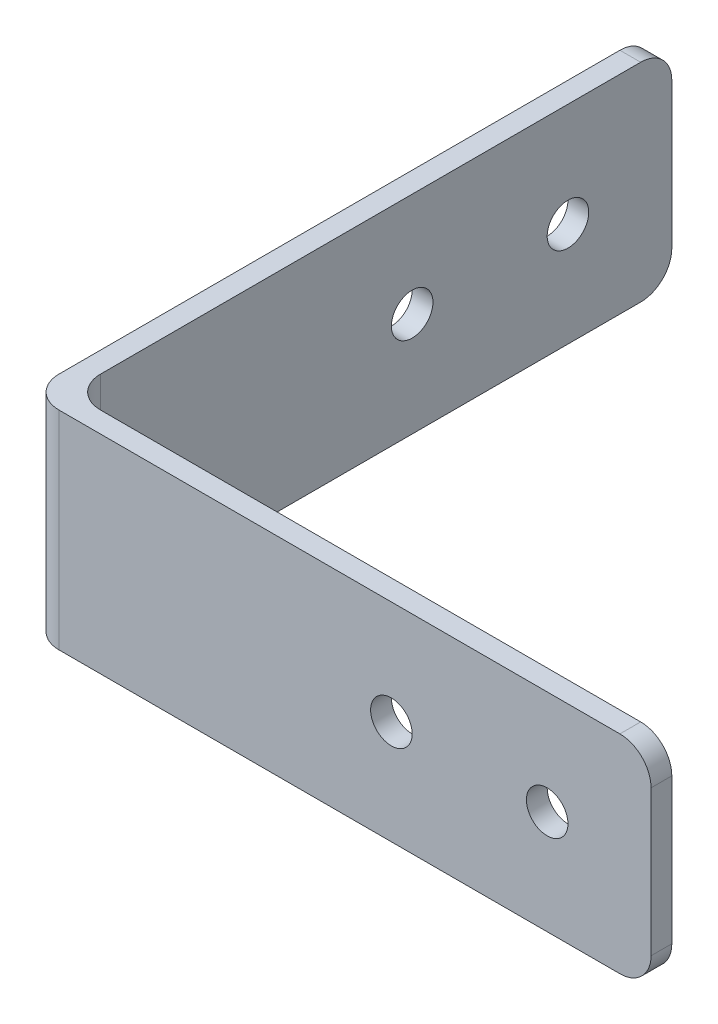
ISO-10303-21;
HEADER;
FILE_DESCRIPTION(('STEP AP214'),'2;1');
FILE_NAME('part.step','',(''),(''),'','','');
FILE_SCHEMA(('AUTOMOTIVE_DESIGN { 1 0 10303 214 1 1 1 1 }'));
ENDSEC;
DATA;
#1=APPLICATION_CONTEXT('core data for automotive mechanical design processes');
#2=APPLICATION_PROTOCOL_DEFINITION('international standard','automotive_design',2000,#1);
#3=PRODUCT_CONTEXT('',#1,'mechanical');
#4=PRODUCT('Part','Part','',(#3));
#5=PRODUCT_RELATED_PRODUCT_CATEGORY('part','',(#4));
#6=PRODUCT_DEFINITION_FORMATION('','',#4);
#7=PRODUCT_DEFINITION_CONTEXT('part definition',#1,'design');
#8=PRODUCT_DEFINITION('design','',#6,#7);
#9=PRODUCT_DEFINITION_SHAPE('','',#8);
#10=(LENGTH_UNIT() NAMED_UNIT(*) SI_UNIT(.MILLI.,.METRE.));
#11=(NAMED_UNIT(*) PLANE_ANGLE_UNIT() SI_UNIT($,.RADIAN.));
#12=(NAMED_UNIT(*) SI_UNIT($,.STERADIAN.) SOLID_ANGLE_UNIT());
#13=UNCERTAINTY_MEASURE_WITH_UNIT(LENGTH_MEASURE(1.E-05),#10,'distance_accuracy_value','');
#14=(GEOMETRIC_REPRESENTATION_CONTEXT(3) GLOBAL_UNCERTAINTY_ASSIGNED_CONTEXT((#13)) GLOBAL_UNIT_ASSIGNED_CONTEXT((#10,
#11,#12)) REPRESENTATION_CONTEXT('',''));
#15=CARTESIAN_POINT('',(0.,0.,0.));
#16=DIRECTION('',(0.,0.,1.));
#17=DIRECTION('',(1.,0.,0.));
#18=AXIS2_PLACEMENT_3D('',#15,#16,#17);
#19=CARTESIAN_POINT('',(-33.6448598130841,20.,-36.3551401869159));
#20=DIRECTION('',(0.,0.,1.));
#21=DIRECTION('',(1.,0.,0.));
#22=AXIS2_PLACEMENT_3D('',#19,#20,#21);
#23=PLANE('',#22);
#24=DIRECTION('',(0.,-1.,0.));
#25=VECTOR('',#24,1.);
#26=CARTESIAN_POINT('',(-31.6448598130841,20.,-36.3551401869159));
#27=LINE('',#26,#25);
#28=CARTESIAN_POINT('',(-31.6448598130841,17.,-36.3551401869159));
#29=VERTEX_POINT('',#28);
#30=CARTESIAN_POINT('',(-31.6448598130841,3.,-36.3551401869159));
#31=VERTEX_POINT('',#30);
#32=EDGE_CURVE('E162',#29,#31,#27,.T.);
#33=ORIENTED_EDGE('',*,*,#32,.T.);
#34=DIRECTION('',(-1.,0.,0.));
#35=VECTOR('',#34,1.);
#36=CARTESIAN_POINT('',(-33.6448598130841,3.,-36.3551401869159));
#37=LINE('',#36,#35);
#38=CARTESIAN_POINT('',(-33.6448598130841,3.,-36.3551401869159));
#39=VERTEX_POINT('',#38);
#40=EDGE_CURVE('E208',#31,#39,#37,.T.);
#41=ORIENTED_EDGE('',*,*,#40,.T.);
#42=DIRECTION('',(0.,-1.,0.));
#43=VECTOR('',#42,1.);
#44=CARTESIAN_POINT('',(-33.6448598130841,20.,-36.3551401869159));
#45=LINE('',#44,#43);
#46=CARTESIAN_POINT('',(-33.6448598130841,17.,-36.3551401869159));
#47=VERTEX_POINT('',#46);
#48=EDGE_CURVE('E178',#47,#39,#45,.T.);
#49=ORIENTED_EDGE('',*,*,#48,.F.);
#50=DIRECTION('',(-1.,0.,0.));
#51=VECTOR('',#50,1.);
#52=CARTESIAN_POINT('',(-33.6448598130841,17.,-36.3551401869159));
#53=LINE('',#52,#51);
#54=EDGE_CURVE('E55',#47,#29,#53,.F.);
#55=ORIENTED_EDGE('',*,*,#54,.T.);
#56=EDGE_LOOP('',(#33,#41,#49,#55));
#57=FACE_BOUND('',#56,.T.);
#58=ADVANCED_FACE('F33',(#57),#23,.F.);
#59=CARTESIAN_POINT('',(-33.6448598130841,20.,23.6448598130841));
#60=DIRECTION('',(1.,0.,0.));
#61=DIRECTION('',(0.,0.,-1.));
#62=AXIS2_PLACEMENT_3D('',#59,#60,#61);
#63=PLANE('',#62);
#64=CARTESIAN_POINT('',(-33.6448598130841,10.,-11.3551401869159));
#65=DIRECTION('',(1.,0.,0.));
#66=DIRECTION('',(0.,0.,-1.));
#67=AXIS2_PLACEMENT_3D('',#64,#65,#66);
#68=CIRCLE('',#67,1.99999999999995);
#69=CARTESIAN_POINT('',(-33.6448598130841,10.,-13.3551401869158));
#70=VERTEX_POINT('',#69);
#71=EDGE_CURVE('E307',#70,#70,#68,.T.);
#72=ORIENTED_EDGE('',*,*,#71,.T.);
#73=EDGE_LOOP('',(#72));
#74=FACE_BOUND('',#73,.T.);
#75=CARTESIAN_POINT('',(-33.6448598130841,10.,-26.3551401869159));
#76=DIRECTION('',(1.,0.,0.));
#77=DIRECTION('',(0.,0.,-1.));
#78=AXIS2_PLACEMENT_3D('',#75,#76,#77);
#79=CIRCLE('',#78,1.99999999999995);
#80=CARTESIAN_POINT('',(-33.6448598130841,10.,-28.3551401869158));
#81=VERTEX_POINT('',#80);
#82=EDGE_CURVE('E315',#81,#81,#79,.T.);
#83=ORIENTED_EDGE('',*,*,#82,.T.);
#84=EDGE_LOOP('',(#83));
#85=FACE_BOUND('',#84,.T.);
#86=ORIENTED_EDGE('',*,*,#48,.T.);
#87=CARTESIAN_POINT('',(-33.6448598130841,3.,-33.3551401869159));
#88=DIRECTION('',(1.,0.,0.));
#89=DIRECTION('',(0.,0.,-1.));
#90=AXIS2_PLACEMENT_3D('',#87,#88,#89);
#91=CIRCLE('',#90,3.);
#92=CARTESIAN_POINT('',(-33.6448598130841,0.,-33.3551401869159));
#93=VERTEX_POINT('',#92);
#94=EDGE_CURVE('E130',#39,#93,#91,.F.);
#95=ORIENTED_EDGE('',*,*,#94,.T.);
#96=DIRECTION('',(0.,0.,1.));
#97=VECTOR('',#96,1.);
#98=CARTESIAN_POINT('',(-33.6448598130841,0.,23.6448598130841));
#99=LINE('',#98,#97);
#100=CARTESIAN_POINT('',(-33.6448598130841,0.,20.6448598130841));
#101=VERTEX_POINT('',#100);
#102=EDGE_CURVE('E163',#93,#101,#99,.T.);
#103=ORIENTED_EDGE('',*,*,#102,.T.);
#104=DIRECTION('',(0.,-1.,0.));
#105=VECTOR('',#104,1.);
#106=CARTESIAN_POINT('',(-33.6448598130841,20.,20.6448598130841));
#107=LINE('',#106,#105);
#108=CARTESIAN_POINT('',(-33.6448598130841,20.,20.6448598130841));
#109=VERTEX_POINT('',#108);
#110=EDGE_CURVE('E131',#101,#109,#107,.F.);
#111=ORIENTED_EDGE('',*,*,#110,.T.);
#112=DIRECTION('',(0.,0.,1.));
#113=VECTOR('',#112,1.);
#114=CARTESIAN_POINT('',(-33.6448598130841,20.,23.6448598130841));
#115=LINE('',#114,#113);
#116=CARTESIAN_POINT('',(-33.6448598130841,20.,-33.3551401869159));
#117=VERTEX_POINT('',#116);
#118=EDGE_CURVE('E138',#117,#109,#115,.T.);
#119=ORIENTED_EDGE('',*,*,#118,.F.);
#120=CARTESIAN_POINT('',(-33.6448598130841,17.,-33.3551401869159));
#121=DIRECTION('',(1.,0.,0.));
#122=DIRECTION('',(0.,0.,-1.));
#123=AXIS2_PLACEMENT_3D('',#120,#121,#122);
#124=CIRCLE('',#123,3.);
#125=EDGE_CURVE('E122',#117,#47,#124,.F.);
#126=ORIENTED_EDGE('',*,*,#125,.T.);
#127=EDGE_LOOP('',(#86,#95,#103,#111,#119,#126));
#128=FACE_BOUND('',#127,.T.);
#129=ADVANCED_FACE('F145',(#74,#85,#128),#63,.F.);
#130=CARTESIAN_POINT('',(26.3551401869159,20.,23.6448598130841));
#131=DIRECTION('',(0.,0.,-1.));
#132=DIRECTION('',(-1.,0.,0.));
#133=AXIS2_PLACEMENT_3D('',#130,#131,#132);
#134=PLANE('',#133);
#135=CARTESIAN_POINT('',(16.3551401869159,9.99999999999999,23.6448598130841));
#136=DIRECTION('',(0.,0.,-1.));
#137=DIRECTION('',(-1.,0.,0.));
#138=AXIS2_PLACEMENT_3D('',#135,#136,#137);
#139=CIRCLE('',#138,2.);
#140=CARTESIAN_POINT('',(14.3551401869159,9.99999999999999,23.6448598130841));
#141=VERTEX_POINT('',#140);
#142=EDGE_CURVE('E321',#141,#141,#139,.T.);
#143=ORIENTED_EDGE('',*,*,#142,.T.);
#144=EDGE_LOOP('',(#143));
#145=FACE_BOUND('',#144,.T.);
#146=CARTESIAN_POINT('',(1.35514018691588,10.,23.6448598130841));
#147=DIRECTION('',(0.,0.,-1.));
#148=DIRECTION('',(-1.,0.,0.));
#149=AXIS2_PLACEMENT_3D('',#146,#147,#148);
#150=CIRCLE('',#149,2.);
#151=CARTESIAN_POINT('',(-0.644859813084124,10.,23.6448598130841));
#152=VERTEX_POINT('',#151);
#153=EDGE_CURVE('E166',#152,#152,#150,.T.);
#154=ORIENTED_EDGE('',*,*,#153,.T.);
#155=EDGE_LOOP('',(#154));
#156=FACE_BOUND('',#155,.T.);
#157=DIRECTION('',(0.,-1.,0.));
#158=VECTOR('',#157,1.);
#159=CARTESIAN_POINT('',(26.3551401869159,20.,23.6448598130841));
#160=LINE('',#159,#158);
#161=CARTESIAN_POINT('',(26.3551401869159,17.,23.6448598130841));
#162=VERTEX_POINT('',#161);
#163=CARTESIAN_POINT('',(26.3551401869159,3.,23.6448598130841));
#164=VERTEX_POINT('',#163);
#165=EDGE_CURVE('E175',#162,#164,#160,.T.);
#166=ORIENTED_EDGE('',*,*,#165,.F.);
#167=CARTESIAN_POINT('',(23.3551401869159,17.,23.6448598130841));
#168=DIRECTION('',(0.,0.,-1.));
#169=DIRECTION('',(-1.,0.,0.));
#170=AXIS2_PLACEMENT_3D('',#167,#168,#169);
#171=CIRCLE('',#170,3.);
#172=CARTESIAN_POINT('',(23.3551401869159,20.,23.6448598130841));
#173=VERTEX_POINT('',#172);
#174=EDGE_CURVE('E199',#162,#173,#171,.F.);
#175=ORIENTED_EDGE('',*,*,#174,.T.);
#176=DIRECTION('',(1.,0.,0.));
#177=VECTOR('',#176,1.);
#178=CARTESIAN_POINT('',(26.3551401869159,20.,23.6448598130841));
#179=LINE('',#178,#177);
#180=CARTESIAN_POINT('',(-30.6448598130841,20.,23.6448598130841));
#181=VERTEX_POINT('',#180);
#182=EDGE_CURVE('E148',#181,#173,#179,.T.);
#183=ORIENTED_EDGE('',*,*,#182,.F.);
#184=DIRECTION('',(0.,-1.,0.));
#185=VECTOR('',#184,1.);
#186=CARTESIAN_POINT('',(-30.6448598130841,20.,23.6448598130841));
#187=LINE('',#186,#185);
#188=CARTESIAN_POINT('',(-30.6448598130841,0.,23.6448598130841));
#189=VERTEX_POINT('',#188);
#190=EDGE_CURVE('E194',#181,#189,#187,.T.);
#191=ORIENTED_EDGE('',*,*,#190,.T.);
#192=DIRECTION('',(1.,0.,0.));
#193=VECTOR('',#192,1.);
#194=CARTESIAN_POINT('',(26.3551401869159,0.,23.6448598130841));
#195=LINE('',#194,#193);
#196=CARTESIAN_POINT('',(23.3551401869159,0.,23.6448598130841));
#197=VERTEX_POINT('',#196);
#198=EDGE_CURVE('E165',#189,#197,#195,.T.);
#199=ORIENTED_EDGE('',*,*,#198,.T.);
#200=CARTESIAN_POINT('',(23.3551401869159,3.,23.6448598130841));
#201=DIRECTION('',(0.,0.,-1.));
#202=DIRECTION('',(-1.,0.,0.));
#203=AXIS2_PLACEMENT_3D('',#200,#201,#202);
#204=CIRCLE('',#203,3.);
#205=EDGE_CURVE('E197',#197,#164,#204,.F.);
#206=ORIENTED_EDGE('',*,*,#205,.T.);
#207=EDGE_LOOP('',(#166,#175,#183,#191,#199,#206));
#208=FACE_BOUND('',#207,.T.);
#209=ADVANCED_FACE('F243',(#145,#156,#208),#134,.F.);
#210=CARTESIAN_POINT('',(26.3551401869159,20.,21.6448598130841));
#211=DIRECTION('',(-1.,0.,0.));
#212=DIRECTION('',(0.,0.,1.));
#213=AXIS2_PLACEMENT_3D('',#210,#211,#212);
#214=PLANE('',#213);
#215=DIRECTION('',(0.,-1.,0.));
#216=VECTOR('',#215,1.);
#217=CARTESIAN_POINT('',(26.3551401869159,20.,21.6448598130841));
#218=LINE('',#217,#216);
#219=CARTESIAN_POINT('',(26.3551401869159,17.,21.6448598130841));
#220=VERTEX_POINT('',#219);
#221=CARTESIAN_POINT('',(26.3551401869159,3.,21.6448598130841));
#222=VERTEX_POINT('',#221);
#223=EDGE_CURVE('E172',#220,#222,#218,.T.);
#224=ORIENTED_EDGE('',*,*,#223,.F.);
#225=DIRECTION('',(0.,0.,-1.));
#226=VECTOR('',#225,1.);
#227=CARTESIAN_POINT('',(26.3551401869159,17.,21.6448598130841));
#228=LINE('',#227,#226);
#229=EDGE_CURVE('E192',#220,#162,#228,.F.);
#230=ORIENTED_EDGE('',*,*,#229,.T.);
#231=ORIENTED_EDGE('',*,*,#165,.T.);
#232=DIRECTION('',(0.,0.,-1.));
#233=VECTOR('',#232,1.);
#234=CARTESIAN_POINT('',(26.3551401869159,3.,21.6448598130841));
#235=LINE('',#234,#233);
#236=EDGE_CURVE('E189',#164,#222,#235,.T.);
#237=ORIENTED_EDGE('',*,*,#236,.T.);
#238=EDGE_LOOP('',(#224,#230,#231,#237));
#239=FACE_BOUND('',#238,.T.);
#240=ADVANCED_FACE('F252',(#239),#214,.F.);
#241=CARTESIAN_POINT('',(-31.6448598130841,20.,21.6448598130841));
#242=DIRECTION('',(0.,0.,1.));
#243=DIRECTION('',(1.,0.,0.));
#244=AXIS2_PLACEMENT_3D('',#241,#242,#243);
#245=PLANE('',#244);
#246=CARTESIAN_POINT('',(16.3551401869159,9.99999999999999,21.6448598130841));
#247=DIRECTION('',(0.,0.,-1.));
#248=DIRECTION('',(-1.,0.,0.));
#249=AXIS2_PLACEMENT_3D('',#246,#247,#248);
#250=CIRCLE('',#249,2.);
#251=CARTESIAN_POINT('',(14.3551401869159,9.99999999999999,21.6448598130841));
#252=VERTEX_POINT('',#251);
#253=EDGE_CURVE('E318',#252,#252,#250,.T.);
#254=ORIENTED_EDGE('',*,*,#253,.F.);
#255=EDGE_LOOP('',(#254));
#256=FACE_BOUND('',#255,.T.);
#257=CARTESIAN_POINT('',(1.35514018691588,10.,21.6448598130841));
#258=DIRECTION('',(0.,0.,-1.));
#259=DIRECTION('',(-1.,0.,0.));
#260=AXIS2_PLACEMENT_3D('',#257,#258,#259);
#261=CIRCLE('',#260,2.);
#262=CARTESIAN_POINT('',(-0.644859813084124,10.,21.6448598130841));
#263=VERTEX_POINT('',#262);
#264=EDGE_CURVE('E156',#263,#263,#261,.T.);
#265=ORIENTED_EDGE('',*,*,#264,.F.);
#266=EDGE_LOOP('',(#265));
#267=FACE_BOUND('',#266,.T.);
#268=DIRECTION('',(-1.,0.,0.));
#269=VECTOR('',#268,1.);
#270=CARTESIAN_POINT('',(-31.6448598130841,20.,21.6448598130841));
#271=LINE('',#270,#269);
#272=CARTESIAN_POINT('',(23.3551401869159,20.,21.6448598130841));
#273=VERTEX_POINT('',#272);
#274=CARTESIAN_POINT('',(-28.6448598130841,20.,21.6448598130841));
#275=VERTEX_POINT('',#274);
#276=EDGE_CURVE('E151',#273,#275,#271,.T.);
#277=ORIENTED_EDGE('',*,*,#276,.F.);
#278=CARTESIAN_POINT('',(23.3551401869159,17.,21.6448598130841));
#279=DIRECTION('',(0.,0.,1.));
#280=DIRECTION('',(1.,0.,0.));
#281=AXIS2_PLACEMENT_3D('',#278,#279,#280);
#282=CIRCLE('',#281,3.);
#283=EDGE_CURVE('E187',#273,#220,#282,.F.);
#284=ORIENTED_EDGE('',*,*,#283,.T.);
#285=ORIENTED_EDGE('',*,*,#223,.T.);
#286=CARTESIAN_POINT('',(23.3551401869159,3.,21.6448598130841));
#287=DIRECTION('',(0.,0.,1.));
#288=DIRECTION('',(1.,0.,0.));
#289=AXIS2_PLACEMENT_3D('',#286,#287,#288);
#290=CIRCLE('',#289,3.);
#291=CARTESIAN_POINT('',(23.3551401869159,0.,21.6448598130841));
#292=VERTEX_POINT('',#291);
#293=EDGE_CURVE('E185',#222,#292,#290,.F.);
#294=ORIENTED_EDGE('',*,*,#293,.T.);
#295=DIRECTION('',(-1.,0.,0.));
#296=VECTOR('',#295,1.);
#297=CARTESIAN_POINT('',(-31.6448598130841,0.,21.6448598130841));
#298=LINE('',#297,#296);
#299=CARTESIAN_POINT('',(-28.6448598130841,0.,21.6448598130841));
#300=VERTEX_POINT('',#299);
#301=EDGE_CURVE('E153',#292,#300,#298,.T.);
#302=ORIENTED_EDGE('',*,*,#301,.T.);
#303=DIRECTION('',(0.,-1.,0.));
#304=VECTOR('',#303,1.);
#305=CARTESIAN_POINT('',(-28.6448598130841,20.,21.6448598130841));
#306=LINE('',#305,#304);
#307=EDGE_CURVE('E183',#300,#275,#306,.F.);
#308=ORIENTED_EDGE('',*,*,#307,.T.);
#309=EDGE_LOOP('',(#277,#284,#285,#294,#302,#308));
#310=FACE_BOUND('',#309,.T.);
#311=ADVANCED_FACE('F228',(#256,#267,#310),#245,.F.);
#312=CARTESIAN_POINT('',(-31.6448598130841,20.,-36.3551401869159));
#313=DIRECTION('',(-1.,0.,0.));
#314=DIRECTION('',(0.,0.,1.));
#315=AXIS2_PLACEMENT_3D('',#312,#313,#314);
#316=PLANE('',#315);
#317=CARTESIAN_POINT('',(-31.6448598130841,10.,-11.3551401869159));
#318=DIRECTION('',(1.,0.,0.));
#319=DIRECTION('',(0.,0.,-1.));
#320=AXIS2_PLACEMENT_3D('',#317,#318,#319);
#321=CIRCLE('',#320,1.99999999999995);
#322=CARTESIAN_POINT('',(-31.6448598130841,10.,-13.3551401869158));
#323=VERTEX_POINT('',#322);
#324=EDGE_CURVE('E310',#323,#323,#321,.T.);
#325=ORIENTED_EDGE('',*,*,#324,.F.);
#326=EDGE_LOOP('',(#325));
#327=FACE_BOUND('',#326,.T.);
#328=CARTESIAN_POINT('',(-31.6448598130841,10.,-26.3551401869159));
#329=DIRECTION('',(1.,0.,0.));
#330=DIRECTION('',(0.,0.,-1.));
#331=AXIS2_PLACEMENT_3D('',#328,#329,#330);
#332=CIRCLE('',#331,1.99999999999995);
#333=CARTESIAN_POINT('',(-31.6448598130841,10.,-28.3551401869158));
#334=VERTEX_POINT('',#333);
#335=EDGE_CURVE('E312',#334,#334,#332,.T.);
#336=ORIENTED_EDGE('',*,*,#335,.F.);
#337=EDGE_LOOP('',(#336));
#338=FACE_BOUND('',#337,.T.);
#339=DIRECTION('',(0.,0.,-1.));
#340=VECTOR('',#339,1.);
#341=CARTESIAN_POINT('',(-31.6448598130841,0.,-36.3551401869159));
#342=LINE('',#341,#340);
#343=CARTESIAN_POINT('',(-31.6448598130841,0.,18.6448598130841));
#344=VERTEX_POINT('',#343);
#345=CARTESIAN_POINT('',(-31.6448598130841,0.,-33.3551401869159));
#346=VERTEX_POINT('',#345);
#347=EDGE_CURVE('E149',#344,#346,#342,.T.);
#348=ORIENTED_EDGE('',*,*,#347,.T.);
#349=CARTESIAN_POINT('',(-31.6448598130841,3.,-33.3551401869159));
#350=DIRECTION('',(-1.,0.,0.));
#351=DIRECTION('',(0.,0.,1.));
#352=AXIS2_PLACEMENT_3D('',#349,#350,#351);
#353=CIRCLE('',#352,3.);
#354=EDGE_CURVE('E48',#346,#31,#353,.F.);
#355=ORIENTED_EDGE('',*,*,#354,.T.);
#356=ORIENTED_EDGE('',*,*,#32,.F.);
#357=CARTESIAN_POINT('',(-31.6448598130841,17.,-33.3551401869159));
#358=DIRECTION('',(-1.,0.,0.));
#359=DIRECTION('',(0.,0.,1.));
#360=AXIS2_PLACEMENT_3D('',#357,#358,#359);
#361=CIRCLE('',#360,3.);
#362=CARTESIAN_POINT('',(-31.6448598130841,20.,-33.3551401869159));
#363=VERTEX_POINT('',#362);
#364=EDGE_CURVE('E216',#29,#363,#361,.F.);
#365=ORIENTED_EDGE('',*,*,#364,.T.);
#366=DIRECTION('',(0.,0.,-1.));
#367=VECTOR('',#366,1.);
#368=CARTESIAN_POINT('',(-31.6448598130841,20.,-36.3551401869159));
#369=LINE('',#368,#367);
#370=CARTESIAN_POINT('',(-31.6448598130841,20.,18.6448598130841));
#371=VERTEX_POINT('',#370);
#372=EDGE_CURVE('E141',#371,#363,#369,.T.);
#373=ORIENTED_EDGE('',*,*,#372,.F.);
#374=DIRECTION('',(0.,-1.,0.));
#375=VECTOR('',#374,1.);
#376=CARTESIAN_POINT('',(-31.6448598130841,0.,18.6448598130841));
#377=LINE('',#376,#375);
#378=EDGE_CURVE('E213',#371,#344,#377,.T.);
#379=ORIENTED_EDGE('',*,*,#378,.T.);
#380=EDGE_LOOP('',(#348,#355,#356,#365,#373,#379));
#381=FACE_BOUND('',#380,.T.);
#382=ADVANCED_FACE('F231',(#327,#338,#381),#316,.F.);
#383=CARTESIAN_POINT('',(0.,20.,0.));
#384=DIRECTION('',(0.,-1.,0.));
#385=DIRECTION('',(0.,0.,-1.));
#386=AXIS2_PLACEMENT_3D('',#383,#384,#385);
#387=PLANE('',#386);
#388=ORIENTED_EDGE('',*,*,#182,.T.);
#389=DIRECTION('',(0.,0.,-1.));
#390=VECTOR('',#389,1.);
#391=CARTESIAN_POINT('',(23.3551401869159,20.,0.));
#392=LINE('',#391,#390);
#393=EDGE_CURVE('E142',#173,#273,#392,.T.);
#394=ORIENTED_EDGE('',*,*,#393,.T.);
#395=ORIENTED_EDGE('',*,*,#276,.T.);
#396=CARTESIAN_POINT('',(-28.6448598130841,20.,18.6448598130841));
#397=DIRECTION('',(0.,-1.,0.));
#398=DIRECTION('',(0.,0.,-1.));
#399=AXIS2_PLACEMENT_3D('',#396,#397,#398);
#400=CIRCLE('',#399,3.);
#401=EDGE_CURVE('E11',#275,#371,#400,.T.);
#402=ORIENTED_EDGE('',*,*,#401,.T.);
#403=ORIENTED_EDGE('',*,*,#372,.T.);
#404=DIRECTION('',(-1.,0.,0.));
#405=VECTOR('',#404,1.);
#406=CARTESIAN_POINT('',(-2.31447778906965E-13,20.,-33.3551401869161));
#407=LINE('',#406,#405);
#408=EDGE_CURVE('E126',#363,#117,#407,.T.);
#409=ORIENTED_EDGE('',*,*,#408,.T.);
#410=ORIENTED_EDGE('',*,*,#118,.T.);
#411=CARTESIAN_POINT('',(-30.6448598130841,20.,20.6448598130841));
#412=DIRECTION('',(0.,-1.,0.));
#413=DIRECTION('',(0.,0.,-1.));
#414=AXIS2_PLACEMENT_3D('',#411,#412,#413);
#415=CIRCLE('',#414,3.);
#416=EDGE_CURVE('E143',#109,#181,#415,.F.);
#417=ORIENTED_EDGE('',*,*,#416,.T.);
#418=EDGE_LOOP('',(#388,#394,#395,#402,#403,#409,#410,#417));
#419=FACE_BOUND('',#418,.T.);
#420=ADVANCED_FACE('F137',(#419),#387,.F.);
#421=CARTESIAN_POINT('',(0.,0.,0.));
#422=DIRECTION('',(0.,-1.,0.));
#423=DIRECTION('',(0.,0.,-1.));
#424=AXIS2_PLACEMENT_3D('',#421,#422,#423);
#425=PLANE('',#424);
#426=ORIENTED_EDGE('',*,*,#301,.F.);
#427=DIRECTION('',(0.,0.,-1.));
#428=VECTOR('',#427,1.);
#429=CARTESIAN_POINT('',(23.3551401869159,0.,23.6448598130841));
#430=LINE('',#429,#428);
#431=EDGE_CURVE('E205',#292,#197,#430,.F.);
#432=ORIENTED_EDGE('',*,*,#431,.T.);
#433=ORIENTED_EDGE('',*,*,#198,.F.);
#434=CARTESIAN_POINT('',(-30.6448598130841,0.,20.6448598130841));
#435=DIRECTION('',(0.,-1.,0.));
#436=DIRECTION('',(0.,0.,-1.));
#437=AXIS2_PLACEMENT_3D('',#434,#435,#436);
#438=CIRCLE('',#437,3.);
#439=EDGE_CURVE('E201',#189,#101,#438,.T.);
#440=ORIENTED_EDGE('',*,*,#439,.T.);
#441=ORIENTED_EDGE('',*,*,#102,.F.);
#442=DIRECTION('',(-1.,0.,0.));
#443=VECTOR('',#442,1.);
#444=CARTESIAN_POINT('',(-31.6448598130841,0.,-33.3551401869159));
#445=LINE('',#444,#443);
#446=EDGE_CURVE('E203',#93,#346,#445,.F.);
#447=ORIENTED_EDGE('',*,*,#446,.T.);
#448=ORIENTED_EDGE('',*,*,#347,.F.);
#449=CARTESIAN_POINT('',(-28.6448598130841,0.,18.6448598130841));
#450=DIRECTION('',(0.,-1.,0.));
#451=DIRECTION('',(0.,0.,-1.));
#452=AXIS2_PLACEMENT_3D('',#449,#450,#451);
#453=CIRCLE('',#452,3.);
#454=EDGE_CURVE('E41',#344,#300,#453,.F.);
#455=ORIENTED_EDGE('',*,*,#454,.T.);
#456=EDGE_LOOP('',(#426,#432,#433,#440,#441,#447,#448,#455));
#457=FACE_BOUND('',#456,.T.);
#458=ADVANCED_FACE('F221',(#457),#425,.T.);
#459=CARTESIAN_POINT('',(23.3551401869159,17.,0.));
#460=DIRECTION('',(0.,0.,-1.));
#461=DIRECTION('',(-1.,0.,0.));
#462=AXIS2_PLACEMENT_3D('',#459,#460,#461);
#463=CYLINDRICAL_SURFACE('',#462,3.);
#464=ORIENTED_EDGE('',*,*,#174,.F.);
#465=ORIENTED_EDGE('',*,*,#229,.F.);
#466=ORIENTED_EDGE('',*,*,#283,.F.);
#467=ORIENTED_EDGE('',*,*,#393,.F.);
#468=EDGE_LOOP('',(#464,#465,#466,#467));
#469=FACE_BOUND('',#468,.T.);
#470=ADVANCED_FACE('F248',(#469),#463,.T.);
#471=CARTESIAN_POINT('',(23.3551401869159,3.,21.6448598130841));
#472=DIRECTION('',(0.,0.,1.));
#473=DIRECTION('',(1.,0.,0.));
#474=AXIS2_PLACEMENT_3D('',#471,#472,#473);
#475=CYLINDRICAL_SURFACE('',#474,3.);
#476=ORIENTED_EDGE('',*,*,#205,.F.);
#477=ORIENTED_EDGE('',*,*,#431,.F.);
#478=ORIENTED_EDGE('',*,*,#293,.F.);
#479=ORIENTED_EDGE('',*,*,#236,.F.);
#480=EDGE_LOOP('',(#476,#477,#478,#479));
#481=FACE_BOUND('',#480,.T.);
#482=ADVANCED_FACE('F255',(#481),#475,.T.);
#483=CARTESIAN_POINT('',(-33.6448598130841,3.,-33.3551401869159));
#484=DIRECTION('',(1.,0.,0.));
#485=DIRECTION('',(0.,0.,-1.));
#486=AXIS2_PLACEMENT_3D('',#483,#484,#485);
#487=CYLINDRICAL_SURFACE('',#486,3.);
#488=ORIENTED_EDGE('',*,*,#354,.F.);
#489=ORIENTED_EDGE('',*,*,#446,.F.);
#490=ORIENTED_EDGE('',*,*,#94,.F.);
#491=ORIENTED_EDGE('',*,*,#40,.F.);
#492=EDGE_LOOP('',(#488,#489,#490,#491));
#493=FACE_BOUND('',#492,.T.);
#494=ADVANCED_FACE('F234',(#493),#487,.T.);
#495=CARTESIAN_POINT('',(-2.31447778906965E-13,17.,-33.3551401869161));
#496=DIRECTION('',(-1.,0.,0.));
#497=DIRECTION('',(0.,0.,1.));
#498=AXIS2_PLACEMENT_3D('',#495,#496,#497);
#499=CYLINDRICAL_SURFACE('',#498,3.);
#500=ORIENTED_EDGE('',*,*,#364,.F.);
#501=ORIENTED_EDGE('',*,*,#54,.F.);
#502=ORIENTED_EDGE('',*,*,#125,.F.);
#503=ORIENTED_EDGE('',*,*,#408,.F.);
#504=EDGE_LOOP('',(#500,#501,#502,#503));
#505=FACE_BOUND('',#504,.T.);
#506=ADVANCED_FACE('F125',(#505),#499,.T.);
#507=CARTESIAN_POINT('',(-28.6448598130841,20.,18.6448598130841));
#508=DIRECTION('',(0.,1.,0.));
#509=DIRECTION('',(0.,0.,1.));
#510=AXIS2_PLACEMENT_3D('',#507,#508,#509);
#511=CYLINDRICAL_SURFACE('',#510,3.);
#512=ORIENTED_EDGE('',*,*,#401,.F.);
#513=ORIENTED_EDGE('',*,*,#307,.F.);
#514=ORIENTED_EDGE('',*,*,#454,.F.);
#515=ORIENTED_EDGE('',*,*,#378,.F.);
#516=EDGE_LOOP('',(#512,#513,#514,#515));
#517=FACE_BOUND('',#516,.T.);
#518=ADVANCED_FACE('F230',(#517),#511,.F.);
#519=CARTESIAN_POINT('',(-30.6448598130841,20.,20.6448598130841));
#520=DIRECTION('',(0.,-1.,0.));
#521=DIRECTION('',(0.,0.,-1.));
#522=AXIS2_PLACEMENT_3D('',#519,#520,#521);
#523=CYLINDRICAL_SURFACE('',#522,3.);
#524=ORIENTED_EDGE('',*,*,#416,.F.);
#525=ORIENTED_EDGE('',*,*,#110,.F.);
#526=ORIENTED_EDGE('',*,*,#439,.F.);
#527=ORIENTED_EDGE('',*,*,#190,.F.);
#528=EDGE_LOOP('',(#524,#525,#526,#527));
#529=FACE_BOUND('',#528,.T.);
#530=ADVANCED_FACE('F35',(#529),#523,.T.);
#531=CARTESIAN_POINT('',(1.35514018691588,10.,23.6448598130841));
#532=DIRECTION('',(0.,0.,-1.));
#533=DIRECTION('',(-1.,0.,0.));
#534=AXIS2_PLACEMENT_3D('',#531,#532,#533);
#535=CYLINDRICAL_SURFACE('',#534,2.);
#536=ORIENTED_EDGE('',*,*,#153,.F.);
#537=EDGE_LOOP('',(#536));
#538=FACE_BOUND('',#537,.T.);
#539=ORIENTED_EDGE('',*,*,#264,.T.);
#540=EDGE_LOOP('',(#539));
#541=FACE_BOUND('',#540,.T.);
#542=ADVANCED_FACE('F287',(#538,#541),#535,.F.);
#543=CARTESIAN_POINT('',(16.3551401869159,9.99999999999999,23.6448598130841));
#544=DIRECTION('',(0.,0.,-1.));
#545=DIRECTION('',(-1.,0.,0.));
#546=AXIS2_PLACEMENT_3D('',#543,#544,#545);
#547=CYLINDRICAL_SURFACE('',#546,2.);
#548=ORIENTED_EDGE('',*,*,#142,.F.);
#549=EDGE_LOOP('',(#548));
#550=FACE_BOUND('',#549,.T.);
#551=ORIENTED_EDGE('',*,*,#253,.T.);
#552=EDGE_LOOP('',(#551));
#553=FACE_BOUND('',#552,.T.);
#554=ADVANCED_FACE('F290',(#550,#553),#547,.F.);
#555=CARTESIAN_POINT('',(-33.6448598130841,10.,-26.3551401869159));
#556=DIRECTION('',(1.,0.,0.));
#557=DIRECTION('',(0.,0.,-1.));
#558=AXIS2_PLACEMENT_3D('',#555,#556,#557);
#559=CYLINDRICAL_SURFACE('',#558,1.99999999999995);
#560=ORIENTED_EDGE('',*,*,#82,.F.);
#561=EDGE_LOOP('',(#560));
#562=FACE_BOUND('',#561,.T.);
#563=ORIENTED_EDGE('',*,*,#335,.T.);
#564=EDGE_LOOP('',(#563));
#565=FACE_BOUND('',#564,.T.);
#566=ADVANCED_FACE('F294',(#562,#565),#559,.F.);
#567=CARTESIAN_POINT('',(-33.6448598130841,10.,-11.3551401869159));
#568=DIRECTION('',(1.,0.,0.));
#569=DIRECTION('',(0.,0.,-1.));
#570=AXIS2_PLACEMENT_3D('',#567,#568,#569);
#571=CYLINDRICAL_SURFACE('',#570,1.99999999999995);
#572=ORIENTED_EDGE('',*,*,#71,.F.);
#573=EDGE_LOOP('',(#572));
#574=FACE_BOUND('',#573,.T.);
#575=ORIENTED_EDGE('',*,*,#324,.T.);
#576=EDGE_LOOP('',(#575));
#577=FACE_BOUND('',#576,.T.);
#578=ADVANCED_FACE('F298',(#574,#577),#571,.F.);
#579=CLOSED_SHELL('',(#58,#129,#209,#240,#311,#382,#420,#458,#470,#482,#494,#506,#518,#530,#542,
#554,#566,#578));
#580=MANIFOLD_SOLID_BREP('B2',#579);
#581=ADVANCED_BREP_SHAPE_REPRESENTATION('',(#18,#580),#14);
#582=SHAPE_DEFINITION_REPRESENTATION(#9,#581);
ENDSEC;
END-ISO-10303-21;
